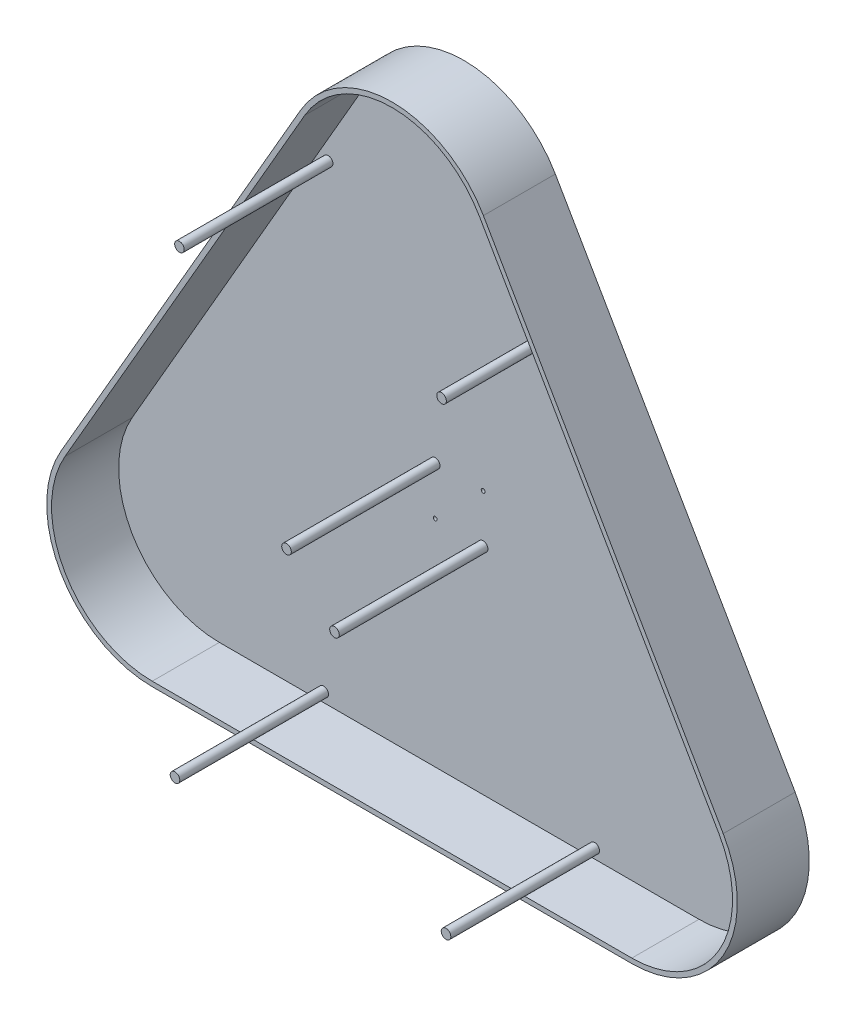
ISO-10303-21;
HEADER;
FILE_DESCRIPTION(('STEP AP214'),'2;1');
FILE_NAME('part.step','',(''),(''),'','','');
FILE_SCHEMA(('AUTOMOTIVE_DESIGN { 1 0 10303 214 1 1 1 1 }'));
ENDSEC;
DATA;
#1=APPLICATION_CONTEXT('core data for automotive mechanical design processes');
#2=APPLICATION_PROTOCOL_DEFINITION('international standard','automotive_design',2000,#1);
#3=PRODUCT_CONTEXT('',#1,'mechanical');
#4=PRODUCT('Part','Part','',(#3));
#5=PRODUCT_RELATED_PRODUCT_CATEGORY('part','',(#4));
#6=PRODUCT_DEFINITION_FORMATION('','',#4);
#7=PRODUCT_DEFINITION_CONTEXT('part definition',#1,'design');
#8=PRODUCT_DEFINITION('design','',#6,#7);
#9=PRODUCT_DEFINITION_SHAPE('','',#8);
#10=(LENGTH_UNIT() NAMED_UNIT(*) SI_UNIT(.MILLI.,.METRE.));
#11=(NAMED_UNIT(*) PLANE_ANGLE_UNIT() SI_UNIT($,.RADIAN.));
#12=(NAMED_UNIT(*) SI_UNIT($,.STERADIAN.) SOLID_ANGLE_UNIT());
#13=UNCERTAINTY_MEASURE_WITH_UNIT(LENGTH_MEASURE(1.E-05),#10,'distance_accuracy_value','');
#14=(GEOMETRIC_REPRESENTATION_CONTEXT(3) GLOBAL_UNCERTAINTY_ASSIGNED_CONTEXT((#13)) GLOBAL_UNIT_ASSIGNED_CONTEXT((#10,
#11,#12)) REPRESENTATION_CONTEXT('',''));
#15=CARTESIAN_POINT('',(0.,0.,0.));
#16=DIRECTION('',(0.,0.,1.));
#17=DIRECTION('',(1.,0.,0.));
#18=AXIS2_PLACEMENT_3D('',#15,#16,#17);
#19=CARTESIAN_POINT('',(-250.,-144.337567297407,5.));
#20=DIRECTION('',(0.,0.,1.));
#21=DIRECTION('',(1.,0.,0.));
#22=AXIS2_PLACEMENT_3D('',#19,#20,#21);
#23=PLANE('',#22);
#24=CARTESIAN_POINT('',(141.281953731993,-239.337567297406,5.));
#25=DIRECTION('',(0.,0.,1.));
#26=DIRECTION('',(1.,0.,0.));
#27=AXIS2_PLACEMENT_3D('',#24,#25,#26);
#28=CIRCLE('',#27,5.00000000000002);
#29=CARTESIAN_POINT('',(146.281953731993,-239.337567297406,5.));
#30=VERTEX_POINT('',#29);
#31=EDGE_CURVE('E15025',#30,#30,#28,.T.);
#32=ORIENTED_EDGE('',*,*,#31,.F.);
#33=EDGE_LOOP('',(#32));
#34=FACE_BOUND('',#33,.T.);
#35=CARTESIAN_POINT('',(-141.281953731986,-239.337567297406,5.));
#36=DIRECTION('',(0.,0.,1.));
#37=DIRECTION('',(1.,0.,0.));
#38=AXIS2_PLACEMENT_3D('',#35,#36,#37);
#39=CIRCLE('',#38,4.99999999999999);
#40=CARTESIAN_POINT('',(-136.281953731986,-239.337567297406,5.));
#41=VERTEX_POINT('',#40);
#42=EDGE_CURVE('E15032',#41,#41,#39,.T.);
#43=ORIENTED_EDGE('',*,*,#42,.F.);
#44=EDGE_LOOP('',(#43));
#45=FACE_BOUND('',#44,.T.);
#46=CARTESIAN_POINT('',(-136.631436493527,242.022544676904,5.));
#47=DIRECTION('',(0.,0.,1.));
#48=DIRECTION('',(1.,0.,0.));
#49=AXIS2_PLACEMENT_3D('',#46,#47,#48);
#50=CIRCLE('',#49,4.99999999999999);
#51=CARTESIAN_POINT('',(-131.631436493527,242.022544676904,5.));
#52=VERTEX_POINT('',#51);
#53=EDGE_CURVE('E15040',#52,#52,#50,.T.);
#54=ORIENTED_EDGE('',*,*,#53,.F.);
#55=EDGE_LOOP('',(#54));
#56=FACE_BOUND('',#55,.T.);
#57=CARTESIAN_POINT('',(136.631436493528,242.022544676907,5.));
#58=DIRECTION('',(0.,0.,1.));
#59=DIRECTION('',(1.,0.,0.));
#60=AXIS2_PLACEMENT_3D('',#57,#58,#59);
#61=CIRCLE('',#60,4.99999999999999);
#62=CARTESIAN_POINT('',(141.631436493528,242.022544676907,5.));
#63=VERTEX_POINT('',#62);
#64=EDGE_CURVE('E15048',#63,#63,#61,.T.);
#65=ORIENTED_EDGE('',*,*,#64,.F.);
#66=EDGE_LOOP('',(#65));
#67=FACE_BOUND('',#66,.T.);
#68=CARTESIAN_POINT('',(25.,-25.,5.));
#69=DIRECTION('',(0.,0.,1.));
#70=DIRECTION('',(1.,0.,0.));
#71=AXIS2_PLACEMENT_3D('',#68,#69,#70);
#72=CIRCLE('',#71,5.);
#73=CARTESIAN_POINT('',(30.,-25.,5.));
#74=VERTEX_POINT('',#73);
#75=EDGE_CURVE('E15056',#74,#74,#72,.T.);
#76=ORIENTED_EDGE('',*,*,#75,.F.);
#77=EDGE_LOOP('',(#76));
#78=FACE_BOUND('',#77,.T.);
#79=CARTESIAN_POINT('',(-25.,25.,5.));
#80=DIRECTION('',(0.,0.,1.));
#81=DIRECTION('',(1.,0.,0.));
#82=AXIS2_PLACEMENT_3D('',#79,#80,#81);
#83=CIRCLE('',#82,5.);
#84=CARTESIAN_POINT('',(-20.,25.,5.));
#85=VERTEX_POINT('',#84);
#86=EDGE_CURVE('E15067',#85,#85,#83,.T.);
#87=ORIENTED_EDGE('',*,*,#86,.F.);
#88=EDGE_LOOP('',(#87));
#89=FACE_BOUND('',#88,.T.);
#90=CARTESIAN_POINT('',(25.,25.,5.));
#91=DIRECTION('',(0.,0.,1.));
#92=DIRECTION('',(1.,0.,0.));
#93=AXIS2_PLACEMENT_3D('',#90,#91,#92);
#94=CIRCLE('',#93,2.);
#95=CARTESIAN_POINT('',(27.,25.,5.));
#96=VERTEX_POINT('',#95);
#97=EDGE_CURVE('E14584',#96,#96,#94,.T.);
#98=ORIENTED_EDGE('',*,*,#97,.F.);
#99=EDGE_LOOP('',(#98));
#100=FACE_BOUND('',#99,.T.);
#101=CARTESIAN_POINT('',(-25.,-25.,5.));
#102=DIRECTION('',(0.,0.,1.));
#103=DIRECTION('',(1.,0.,0.));
#104=AXIS2_PLACEMENT_3D('',#101,#102,#103);
#105=CIRCLE('',#104,2.);
#106=CARTESIAN_POINT('',(-23.,-25.,5.));
#107=VERTEX_POINT('',#106);
#108=EDGE_CURVE('E14593',#107,#107,#105,.T.);
#109=ORIENTED_EDGE('',*,*,#108,.F.);
#110=EDGE_LOOP('',(#109));
#111=FACE_BOUND('',#110,.T.);
#112=CARTESIAN_POINT('',(-250.,-144.337567297407,5.));
#113=DIRECTION('',(0.,0.,1.));
#114=DIRECTION('',(1.,0.,0.));
#115=AXIS2_PLACEMENT_3D('',#112,#113,#114);
#116=CIRCLE('',#115,105.);
#117=CARTESIAN_POINT('',(-340.932667397366,-91.837567297407,5.));
#118=VERTEX_POINT('',#117);
#119=CARTESIAN_POINT('',(-250.,-249.337567297407,5.));
#120=VERTEX_POINT('',#119);
#121=EDGE_CURVE('E14603',#118,#120,#116,.T.);
#122=ORIENTED_EDGE('',*,*,#121,.T.);
#123=DIRECTION('',(1.,0.,0.));
#124=VECTOR('',#123,1.);
#125=CARTESIAN_POINT('',(-250.,-249.337567297407,5.));
#126=LINE('',#125,#124);
#127=CARTESIAN_POINT('',(250.,-249.337567297407,5.));
#128=VERTEX_POINT('',#127);
#129=EDGE_CURVE('E14463',#120,#128,#126,.T.);
#130=ORIENTED_EDGE('',*,*,#129,.T.);
#131=CARTESIAN_POINT('',(250.,-144.337567297407,5.));
#132=DIRECTION('',(0.,0.,1.));
#133=DIRECTION('',(1.,0.,0.));
#134=AXIS2_PLACEMENT_3D('',#131,#132,#133);
#135=CIRCLE('',#134,105.);
#136=CARTESIAN_POINT('',(340.932667397366,-91.8375672974071,5.));
#137=VERTEX_POINT('',#136);
#138=EDGE_CURVE('E14608',#128,#137,#135,.T.);
#139=ORIENTED_EDGE('',*,*,#138,.T.);
#140=DIRECTION('',(-0.5,0.866025403784439,0.));
#141=VECTOR('',#140,1.);
#142=CARTESIAN_POINT('',(340.932667397366,-91.8375672974071,5.));
#143=LINE('',#142,#141);
#144=CARTESIAN_POINT('',(90.9326673973661,341.175134594813,5.));
#145=VERTEX_POINT('',#144);
#146=EDGE_CURVE('E14391',#137,#145,#143,.T.);
#147=ORIENTED_EDGE('',*,*,#146,.T.);
#148=CARTESIAN_POINT('',(0.,288.675134594813,5.));
#149=DIRECTION('',(0.,0.,1.));
#150=DIRECTION('',(-1.,0.,0.));
#151=AXIS2_PLACEMENT_3D('',#148,#149,#150);
#152=CIRCLE('',#151,105.);
#153=CARTESIAN_POINT('',(-90.9326673973661,341.175134594813,5.));
#154=VERTEX_POINT('',#153);
#155=EDGE_CURVE('E14376',#145,#154,#152,.T.);
#156=ORIENTED_EDGE('',*,*,#155,.T.);
#157=DIRECTION('',(-0.5,-0.866025403784439,0.));
#158=VECTOR('',#157,1.);
#159=CARTESIAN_POINT('',(-90.9326673973661,341.175134594813,5.));
#160=LINE('',#159,#158);
#161=EDGE_CURVE('E12',#154,#118,#160,.T.);
#162=ORIENTED_EDGE('',*,*,#161,.T.);
#163=EDGE_LOOP('',(#122,#130,#139,#147,#156,#162));
#164=FACE_BOUND('',#163,.T.);
#165=ADVANCED_FACE('F14367',(#34,#45,#56,#67,#78,#89,#100,#111,#164),#23,.T.);
#166=CARTESIAN_POINT('',(-250.,-144.337567297407,0.));
#167=DIRECTION('',(0.,0.,1.));
#168=DIRECTION('',(1.,0.,0.));
#169=AXIS2_PLACEMENT_3D('',#166,#167,#168);
#170=PLANE('',#169);
#171=CARTESIAN_POINT('',(25.,25.,0.));
#172=DIRECTION('',(0.,0.,1.));
#173=DIRECTION('',(1.,0.,0.));
#174=AXIS2_PLACEMENT_3D('',#171,#172,#173);
#175=CIRCLE('',#174,2.);
#176=CARTESIAN_POINT('',(27.,25.,0.));
#177=VERTEX_POINT('',#176);
#178=EDGE_CURVE('E14589',#177,#177,#175,.T.);
#179=ORIENTED_EDGE('',*,*,#178,.T.);
#180=EDGE_LOOP('',(#179));
#181=FACE_BOUND('',#180,.T.);
#182=CARTESIAN_POINT('',(-25.,-25.,0.));
#183=DIRECTION('',(0.,0.,1.));
#184=DIRECTION('',(1.,0.,0.));
#185=AXIS2_PLACEMENT_3D('',#182,#183,#184);
#186=CIRCLE('',#185,2.);
#187=CARTESIAN_POINT('',(-23.,-25.,0.));
#188=VERTEX_POINT('',#187);
#189=EDGE_CURVE('E14583',#188,#188,#186,.T.);
#190=ORIENTED_EDGE('',*,*,#189,.T.);
#191=EDGE_LOOP('',(#190));
#192=FACE_BOUND('',#191,.T.);
#193=CARTESIAN_POINT('',(25.,-25.,0.));
#194=DIRECTION('',(0.,0.,1.));
#195=DIRECTION('',(1.,0.,0.));
#196=AXIS2_PLACEMENT_3D('',#193,#194,#195);
#197=CIRCLE('',#196,2.);
#198=CARTESIAN_POINT('',(27.,-25.,0.));
#199=VERTEX_POINT('',#198);
#200=EDGE_CURVE('E14565',#199,#199,#197,.T.);
#201=ORIENTED_EDGE('',*,*,#200,.T.);
#202=EDGE_LOOP('',(#201));
#203=FACE_BOUND('',#202,.T.);
#204=CARTESIAN_POINT('',(-25.,25.,0.));
#205=DIRECTION('',(0.,0.,1.));
#206=DIRECTION('',(1.,0.,0.));
#207=AXIS2_PLACEMENT_3D('',#204,#205,#206);
#208=CIRCLE('',#207,2.);
#209=CARTESIAN_POINT('',(-23.,25.,0.));
#210=VERTEX_POINT('',#209);
#211=EDGE_CURVE('E14588',#210,#210,#208,.T.);
#212=ORIENTED_EDGE('',*,*,#211,.T.);
#213=EDGE_LOOP('',(#212));
#214=FACE_BOUND('',#213,.T.);
#215=CARTESIAN_POINT('',(-250.,-144.337567297407,0.));
#216=DIRECTION('',(0.,0.,1.));
#217=DIRECTION('',(1.,0.,0.));
#218=AXIS2_PLACEMENT_3D('',#215,#216,#217);
#219=CIRCLE('',#218,110.);
#220=CARTESIAN_POINT('',(-345.262794416288,-89.337567297407,0.));
#221=VERTEX_POINT('',#220);
#222=CARTESIAN_POINT('',(-250.,-254.337567297407,0.));
#223=VERTEX_POINT('',#222);
#224=EDGE_CURVE('E14526',#221,#223,#219,.T.);
#225=ORIENTED_EDGE('',*,*,#224,.F.);
#226=DIRECTION('',(-0.5,-0.866025403784439,0.));
#227=VECTOR('',#226,1.);
#228=CARTESIAN_POINT('',(-95.2627944162883,343.675134594813,0.));
#229=LINE('',#228,#227);
#230=CARTESIAN_POINT('',(-95.2627944162883,343.675134594813,0.));
#231=VERTEX_POINT('',#230);
#232=EDGE_CURVE('E14557',#231,#221,#229,.T.);
#233=ORIENTED_EDGE('',*,*,#232,.F.);
#234=CARTESIAN_POINT('',(0.,288.675134594813,0.));
#235=DIRECTION('',(0.,0.,1.));
#236=DIRECTION('',(1.,0.,0.));
#237=AXIS2_PLACEMENT_3D('',#234,#235,#236);
#238=CIRCLE('',#237,110.);
#239=CARTESIAN_POINT('',(95.2627944162883,343.675134594813,0.));
#240=VERTEX_POINT('',#239);
#241=EDGE_CURVE('E14553',#240,#231,#238,.T.);
#242=ORIENTED_EDGE('',*,*,#241,.F.);
#243=DIRECTION('',(-0.5,0.866025403784439,0.));
#244=VECTOR('',#243,1.);
#245=CARTESIAN_POINT('',(345.262794416288,-89.3375672974071,0.));
#246=LINE('',#245,#244);
#247=CARTESIAN_POINT('',(345.262794416288,-89.3375672974071,0.));
#248=VERTEX_POINT('',#247);
#249=EDGE_CURVE('E14549',#248,#240,#246,.T.);
#250=ORIENTED_EDGE('',*,*,#249,.F.);
#251=CARTESIAN_POINT('',(250.,-144.337567297407,0.));
#252=DIRECTION('',(0.,0.,1.));
#253=DIRECTION('',(1.,0.,0.));
#254=AXIS2_PLACEMENT_3D('',#251,#252,#253);
#255=CIRCLE('',#254,110.);
#256=CARTESIAN_POINT('',(250.,-254.337567297407,0.));
#257=VERTEX_POINT('',#256);
#258=EDGE_CURVE('E14545',#257,#248,#255,.T.);
#259=ORIENTED_EDGE('',*,*,#258,.F.);
#260=DIRECTION('',(1.,0.,0.));
#261=VECTOR('',#260,1.);
#262=CARTESIAN_POINT('',(-250.,-254.337567297407,0.));
#263=LINE('',#262,#261);
#264=EDGE_CURVE('E14541',#223,#257,#263,.T.);
#265=ORIENTED_EDGE('',*,*,#264,.F.);
#266=EDGE_LOOP('',(#225,#233,#242,#250,#259,#265));
#267=FACE_BOUND('',#266,.T.);
#268=ADVANCED_FACE('F14369',(#181,#192,#203,#214,#267),#170,.F.);
#269=CARTESIAN_POINT('',(-25.,25.,0.));
#270=DIRECTION('',(0.,0.,1.));
#271=DIRECTION('',(1.,0.,0.));
#272=AXIS2_PLACEMENT_3D('',#269,#270,#271);
#273=CYLINDRICAL_SURFACE('',#272,2.);
#274=ORIENTED_EDGE('',*,*,#211,.F.);
#275=EDGE_LOOP('',(#274));
#276=FACE_BOUND('',#275,.T.);
#277=CARTESIAN_POINT('',(-25.,25.,5.));
#278=DIRECTION('',(0.,0.,1.));
#279=DIRECTION('',(1.,0.,0.));
#280=AXIS2_PLACEMENT_3D('',#277,#278,#279);
#281=CIRCLE('',#280,2.);
#282=CARTESIAN_POINT('',(-23.,25.,5.));
#283=VERTEX_POINT('',#282);
#284=EDGE_CURVE('E14478',#283,#283,#281,.F.);
#285=ORIENTED_EDGE('',*,*,#284,.F.);
#286=EDGE_LOOP('',(#285));
#287=FACE_BOUND('',#286,.T.);
#288=ADVANCED_FACE('F14640',(#276,#287),#273,.F.);
#289=CARTESIAN_POINT('',(25.,-25.,0.));
#290=DIRECTION('',(0.,0.,1.));
#291=DIRECTION('',(1.,0.,0.));
#292=AXIS2_PLACEMENT_3D('',#289,#290,#291);
#293=CYLINDRICAL_SURFACE('',#292,2.);
#294=ORIENTED_EDGE('',*,*,#200,.F.);
#295=EDGE_LOOP('',(#294));
#296=FACE_BOUND('',#295,.T.);
#297=CARTESIAN_POINT('',(25.,-25.,5.));
#298=DIRECTION('',(0.,0.,1.));
#299=DIRECTION('',(1.,0.,0.));
#300=AXIS2_PLACEMENT_3D('',#297,#298,#299);
#301=CIRCLE('',#300,2.);
#302=CARTESIAN_POINT('',(27.,-25.,5.));
#303=VERTEX_POINT('',#302);
#304=EDGE_CURVE('E15060',#303,#303,#301,.F.);
#305=ORIENTED_EDGE('',*,*,#304,.F.);
#306=EDGE_LOOP('',(#305));
#307=FACE_BOUND('',#306,.T.);
#308=ADVANCED_FACE('F14647',(#296,#307),#293,.F.);
#309=CARTESIAN_POINT('',(-25.,-25.,0.));
#310=DIRECTION('',(0.,0.,1.));
#311=DIRECTION('',(1.,0.,0.));
#312=AXIS2_PLACEMENT_3D('',#309,#310,#311);
#313=CYLINDRICAL_SURFACE('',#312,2.);
#314=ORIENTED_EDGE('',*,*,#189,.F.);
#315=EDGE_LOOP('',(#314));
#316=FACE_BOUND('',#315,.T.);
#317=ORIENTED_EDGE('',*,*,#108,.T.);
#318=EDGE_LOOP('',(#317));
#319=FACE_BOUND('',#318,.T.);
#320=ADVANCED_FACE('F14649',(#316,#319),#313,.F.);
#321=CARTESIAN_POINT('',(25.,25.,0.));
#322=DIRECTION('',(0.,0.,1.));
#323=DIRECTION('',(1.,0.,0.));
#324=AXIS2_PLACEMENT_3D('',#321,#322,#323);
#325=CYLINDRICAL_SURFACE('',#324,2.);
#326=ORIENTED_EDGE('',*,*,#178,.F.);
#327=EDGE_LOOP('',(#326));
#328=FACE_BOUND('',#327,.T.);
#329=ORIENTED_EDGE('',*,*,#97,.T.);
#330=EDGE_LOOP('',(#329));
#331=FACE_BOUND('',#330,.T.);
#332=ADVANCED_FACE('F14652',(#328,#331),#325,.F.);
#333=CARTESIAN_POINT('',(-250.,-144.337567297407,0.));
#334=DIRECTION('',(0.,0.,1.));
#335=DIRECTION('',(1.,0.,0.));
#336=AXIS2_PLACEMENT_3D('',#333,#334,#335);
#337=CYLINDRICAL_SURFACE('',#336,110.);
#338=DIRECTION('',(0.,0.,1.));
#339=VECTOR('',#338,1.);
#340=CARTESIAN_POINT('',(-250.,-254.337567297407,0.));
#341=LINE('',#340,#339);
#342=CARTESIAN_POINT('',(-250.,-254.337567297407,75.));
#343=VERTEX_POINT('',#342);
#344=EDGE_CURVE('E14561',#223,#343,#341,.T.);
#345=ORIENTED_EDGE('',*,*,#344,.T.);
#346=CARTESIAN_POINT('',(-250.,-144.337567297407,75.));
#347=DIRECTION('',(0.,0.,1.));
#348=DIRECTION('',(1.,0.,0.));
#349=AXIS2_PLACEMENT_3D('',#346,#347,#348);
#350=CIRCLE('',#349,110.);
#351=CARTESIAN_POINT('',(-345.262794416288,-89.337567297407,75.));
#352=VERTEX_POINT('',#351);
#353=EDGE_CURVE('E14501',#352,#343,#350,.T.);
#354=ORIENTED_EDGE('',*,*,#353,.F.);
#355=DIRECTION('',(0.,0.,1.));
#356=VECTOR('',#355,1.);
#357=CARTESIAN_POINT('',(-345.262794416288,-89.337567297407,0.));
#358=LINE('',#357,#356);
#359=EDGE_CURVE('E14562',#221,#352,#358,.T.);
#360=ORIENTED_EDGE('',*,*,#359,.F.);
#361=ORIENTED_EDGE('',*,*,#224,.T.);
#362=EDGE_LOOP('',(#345,#354,#360,#361));
#363=FACE_BOUND('',#362,.T.);
#364=ADVANCED_FACE('F14656',(#363),#337,.T.);
#365=CARTESIAN_POINT('',(-95.2627944162883,343.675134594813,0.));
#366=DIRECTION('',(-0.866025403784439,0.5,0.));
#367=DIRECTION('',(-0.5,-0.866025403784439,0.));
#368=AXIS2_PLACEMENT_3D('',#365,#366,#367);
#369=PLANE('',#368);
#370=ORIENTED_EDGE('',*,*,#359,.T.);
#371=DIRECTION('',(-0.5,-0.866025403784439,0.));
#372=VECTOR('',#371,1.);
#373=CARTESIAN_POINT('',(-95.2627944162883,343.675134594813,75.));
#374=LINE('',#373,#372);
#375=CARTESIAN_POINT('',(-95.2627944162883,343.675134594813,75.));
#376=VERTEX_POINT('',#375);
#377=EDGE_CURVE('E14467',#376,#352,#374,.T.);
#378=ORIENTED_EDGE('',*,*,#377,.F.);
#379=DIRECTION('',(0.,0.,1.));
#380=VECTOR('',#379,1.);
#381=CARTESIAN_POINT('',(-95.2627944162883,343.675134594813,0.));
#382=LINE('',#381,#380);
#383=EDGE_CURVE('E14566',#231,#376,#382,.T.);
#384=ORIENTED_EDGE('',*,*,#383,.F.);
#385=ORIENTED_EDGE('',*,*,#232,.T.);
#386=EDGE_LOOP('',(#370,#378,#384,#385));
#387=FACE_BOUND('',#386,.T.);
#388=ADVANCED_FACE('F14663',(#387),#369,.T.);
#389=CARTESIAN_POINT('',(0.,288.675134594813,0.));
#390=DIRECTION('',(0.,0.,1.));
#391=DIRECTION('',(1.,0.,0.));
#392=AXIS2_PLACEMENT_3D('',#389,#390,#391);
#393=CYLINDRICAL_SURFACE('',#392,110.);
#394=ORIENTED_EDGE('',*,*,#383,.T.);
#395=CARTESIAN_POINT('',(0.,288.675134594813,75.));
#396=DIRECTION('',(0.,0.,1.));
#397=DIRECTION('',(1.,0.,0.));
#398=AXIS2_PLACEMENT_3D('',#395,#396,#397);
#399=CIRCLE('',#398,110.);
#400=CARTESIAN_POINT('',(95.2627944162883,343.675134594813,75.));
#401=VERTEX_POINT('',#400);
#402=EDGE_CURVE('E14517',#401,#376,#399,.T.);
#403=ORIENTED_EDGE('',*,*,#402,.F.);
#404=DIRECTION('',(0.,0.,1.));
#405=VECTOR('',#404,1.);
#406=CARTESIAN_POINT('',(95.2627944162883,343.675134594813,0.));
#407=LINE('',#406,#405);
#408=EDGE_CURVE('E14569',#240,#401,#407,.T.);
#409=ORIENTED_EDGE('',*,*,#408,.F.);
#410=ORIENTED_EDGE('',*,*,#241,.T.);
#411=EDGE_LOOP('',(#394,#403,#409,#410));
#412=FACE_BOUND('',#411,.T.);
#413=ADVANCED_FACE('F14675',(#412),#393,.T.);
#414=CARTESIAN_POINT('',(345.262794416288,-89.3375672974071,0.));
#415=DIRECTION('',(0.866025403784439,0.5,0.));
#416=DIRECTION('',(-0.5,0.866025403784439,0.));
#417=AXIS2_PLACEMENT_3D('',#414,#415,#416);
#418=PLANE('',#417);
#419=ORIENTED_EDGE('',*,*,#408,.T.);
#420=DIRECTION('',(-0.5,0.866025403784439,0.));
#421=VECTOR('',#420,1.);
#422=CARTESIAN_POINT('',(345.262794416288,-89.3375672974071,75.));
#423=LINE('',#422,#421);
#424=CARTESIAN_POINT('',(345.262794416288,-89.3375672974071,75.));
#425=VERTEX_POINT('',#424);
#426=EDGE_CURVE('E14513',#425,#401,#423,.T.);
#427=ORIENTED_EDGE('',*,*,#426,.F.);
#428=DIRECTION('',(0.,0.,1.));
#429=VECTOR('',#428,1.);
#430=CARTESIAN_POINT('',(345.262794416288,-89.3375672974071,0.));
#431=LINE('',#430,#429);
#432=EDGE_CURVE('E14572',#248,#425,#431,.T.);
#433=ORIENTED_EDGE('',*,*,#432,.F.);
#434=ORIENTED_EDGE('',*,*,#249,.T.);
#435=EDGE_LOOP('',(#419,#427,#433,#434));
#436=FACE_BOUND('',#435,.T.);
#437=ADVANCED_FACE('F14671',(#436),#418,.T.);
#438=CARTESIAN_POINT('',(250.,-144.337567297407,0.));
#439=DIRECTION('',(0.,0.,1.));
#440=DIRECTION('',(1.,0.,0.));
#441=AXIS2_PLACEMENT_3D('',#438,#439,#440);
#442=CYLINDRICAL_SURFACE('',#441,110.);
#443=ORIENTED_EDGE('',*,*,#432,.T.);
#444=CARTESIAN_POINT('',(250.,-144.337567297407,75.));
#445=DIRECTION('',(0.,0.,1.));
#446=DIRECTION('',(1.,0.,0.));
#447=AXIS2_PLACEMENT_3D('',#444,#445,#446);
#448=CIRCLE('',#447,110.);
#449=CARTESIAN_POINT('',(250.,-254.337567297407,75.));
#450=VERTEX_POINT('',#449);
#451=EDGE_CURVE('E14509',#450,#425,#448,.T.);
#452=ORIENTED_EDGE('',*,*,#451,.F.);
#453=DIRECTION('',(0.,0.,1.));
#454=VECTOR('',#453,1.);
#455=CARTESIAN_POINT('',(250.,-254.337567297407,0.));
#456=LINE('',#455,#454);
#457=EDGE_CURVE('E14575',#257,#450,#456,.T.);
#458=ORIENTED_EDGE('',*,*,#457,.F.);
#459=ORIENTED_EDGE('',*,*,#258,.T.);
#460=EDGE_LOOP('',(#443,#452,#458,#459));
#461=FACE_BOUND('',#460,.T.);
#462=ADVANCED_FACE('F14667',(#461),#442,.T.);
#463=CARTESIAN_POINT('',(-250.,-254.337567297407,0.));
#464=DIRECTION('',(0.,-1.,0.));
#465=DIRECTION('',(0.,0.,-1.));
#466=AXIS2_PLACEMENT_3D('',#463,#464,#465);
#467=PLANE('',#466);
#468=ORIENTED_EDGE('',*,*,#457,.T.);
#469=DIRECTION('',(1.,0.,0.));
#470=VECTOR('',#469,1.);
#471=CARTESIAN_POINT('',(-250.,-254.337567297407,75.));
#472=LINE('',#471,#470);
#473=EDGE_CURVE('E14505',#343,#450,#472,.T.);
#474=ORIENTED_EDGE('',*,*,#473,.F.);
#475=ORIENTED_EDGE('',*,*,#344,.F.);
#476=ORIENTED_EDGE('',*,*,#264,.T.);
#477=EDGE_LOOP('',(#468,#474,#475,#476));
#478=FACE_BOUND('',#477,.T.);
#479=ADVANCED_FACE('F14630',(#478),#467,.T.);
#480=CARTESIAN_POINT('',(-250.,-144.337567297407,0.));
#481=DIRECTION('',(0.,0.,1.));
#482=DIRECTION('',(1.,0.,0.));
#483=AXIS2_PLACEMENT_3D('',#480,#481,#482);
#484=CYLINDRICAL_SURFACE('',#483,105.);
#485=ORIENTED_EDGE('',*,*,#121,.F.);
#486=DIRECTION('',(0.,0.,1.));
#487=VECTOR('',#486,1.);
#488=CARTESIAN_POINT('',(-340.932667397366,-91.837567297407,0.));
#489=LINE('',#488,#487);
#490=CARTESIAN_POINT('',(-340.932667397366,-91.837567297407,75.));
#491=VERTEX_POINT('',#490);
#492=EDGE_CURVE('E14473',#118,#491,#489,.T.);
#493=ORIENTED_EDGE('',*,*,#492,.T.);
#494=CARTESIAN_POINT('',(-250.,-144.337567297407,75.));
#495=DIRECTION('',(0.,0.,1.));
#496=DIRECTION('',(1.,0.,0.));
#497=AXIS2_PLACEMENT_3D('',#494,#495,#496);
#498=CIRCLE('',#497,105.);
#499=CARTESIAN_POINT('',(-250.,-249.337567297407,75.));
#500=VERTEX_POINT('',#499);
#501=EDGE_CURVE('E14470',#491,#500,#498,.T.);
#502=ORIENTED_EDGE('',*,*,#501,.T.);
#503=DIRECTION('',(0.,0.,1.));
#504=VECTOR('',#503,1.);
#505=CARTESIAN_POINT('',(-250.,-249.337567297407,0.));
#506=LINE('',#505,#504);
#507=EDGE_CURVE('E14456',#120,#500,#506,.T.);
#508=ORIENTED_EDGE('',*,*,#507,.F.);
#509=EDGE_LOOP('',(#485,#493,#502,#508));
#510=FACE_BOUND('',#509,.T.);
#511=ADVANCED_FACE('F14471',(#510),#484,.F.);
#512=CARTESIAN_POINT('',(-90.9326673973661,341.175134594813,0.));
#513=DIRECTION('',(-0.866025403784439,0.5,0.));
#514=DIRECTION('',(-0.5,-0.866025403784439,0.));
#515=AXIS2_PLACEMENT_3D('',#512,#513,#514);
#516=PLANE('',#515);
#517=ORIENTED_EDGE('',*,*,#161,.F.);
#518=DIRECTION('',(0.,0.,1.));
#519=VECTOR('',#518,1.);
#520=CARTESIAN_POINT('',(-90.9326673973661,341.175134594813,0.));
#521=LINE('',#520,#519);
#522=CARTESIAN_POINT('',(-90.9326673973661,341.175134594813,75.));
#523=VERTEX_POINT('',#522);
#524=EDGE_CURVE('E14527',#154,#523,#521,.T.);
#525=ORIENTED_EDGE('',*,*,#524,.T.);
#526=DIRECTION('',(-0.5,-0.866025403784439,0.));
#527=VECTOR('',#526,1.);
#528=CARTESIAN_POINT('',(-90.9326673973661,341.175134594813,75.));
#529=LINE('',#528,#527);
#530=EDGE_CURVE('E14498',#523,#491,#529,.T.);
#531=ORIENTED_EDGE('',*,*,#530,.T.);
#532=ORIENTED_EDGE('',*,*,#492,.F.);
#533=EDGE_LOOP('',(#517,#525,#531,#532));
#534=FACE_BOUND('',#533,.T.);
#535=ADVANCED_FACE('F14622',(#534),#516,.F.);
#536=CARTESIAN_POINT('',(0.,288.675134594813,0.));
#537=DIRECTION('',(0.,0.,1.));
#538=DIRECTION('',(1.,0.,0.));
#539=AXIS2_PLACEMENT_3D('',#536,#537,#538);
#540=CYLINDRICAL_SURFACE('',#539,105.);
#541=ORIENTED_EDGE('',*,*,#155,.F.);
#542=DIRECTION('',(0.,0.,1.));
#543=VECTOR('',#542,1.);
#544=CARTESIAN_POINT('',(90.9326673973661,341.175134594813,0.));
#545=LINE('',#544,#543);
#546=CARTESIAN_POINT('',(90.9326673973661,341.175134594813,75.));
#547=VERTEX_POINT('',#546);
#548=EDGE_CURVE('E14530',#145,#547,#545,.T.);
#549=ORIENTED_EDGE('',*,*,#548,.T.);
#550=CARTESIAN_POINT('',(0.,288.675134594813,75.));
#551=DIRECTION('',(0.,0.,1.));
#552=DIRECTION('',(1.,0.,0.));
#553=AXIS2_PLACEMENT_3D('',#550,#551,#552);
#554=CIRCLE('',#553,105.);
#555=EDGE_CURVE('E14494',#547,#523,#554,.T.);
#556=ORIENTED_EDGE('',*,*,#555,.T.);
#557=ORIENTED_EDGE('',*,*,#524,.F.);
#558=EDGE_LOOP('',(#541,#549,#556,#557));
#559=FACE_BOUND('',#558,.T.);
#560=ADVANCED_FACE('F14618',(#559),#540,.F.);
#561=CARTESIAN_POINT('',(340.932667397366,-91.8375672974071,0.));
#562=DIRECTION('',(0.866025403784439,0.5,0.));
#563=DIRECTION('',(-0.5,0.866025403784439,0.));
#564=AXIS2_PLACEMENT_3D('',#561,#562,#563);
#565=PLANE('',#564);
#566=ORIENTED_EDGE('',*,*,#146,.F.);
#567=DIRECTION('',(0.,0.,1.));
#568=VECTOR('',#567,1.);
#569=CARTESIAN_POINT('',(340.932667397366,-91.8375672974071,0.));
#570=LINE('',#569,#568);
#571=CARTESIAN_POINT('',(340.932667397366,-91.8375672974071,75.));
#572=VERTEX_POINT('',#571);
#573=EDGE_CURVE('E14533',#137,#572,#570,.T.);
#574=ORIENTED_EDGE('',*,*,#573,.T.);
#575=DIRECTION('',(-0.5,0.866025403784439,0.));
#576=VECTOR('',#575,1.);
#577=CARTESIAN_POINT('',(340.932667397366,-91.8375672974071,75.));
#578=LINE('',#577,#576);
#579=EDGE_CURVE('E14487',#572,#547,#578,.T.);
#580=ORIENTED_EDGE('',*,*,#579,.T.);
#581=ORIENTED_EDGE('',*,*,#548,.F.);
#582=EDGE_LOOP('',(#566,#574,#580,#581));
#583=FACE_BOUND('',#582,.T.);
#584=ADVANCED_FACE('F14619',(#583),#565,.F.);
#585=CARTESIAN_POINT('',(250.,-144.337567297407,0.));
#586=DIRECTION('',(0.,0.,1.));
#587=DIRECTION('',(1.,0.,0.));
#588=AXIS2_PLACEMENT_3D('',#585,#586,#587);
#589=CYLINDRICAL_SURFACE('',#588,105.);
#590=ORIENTED_EDGE('',*,*,#138,.F.);
#591=DIRECTION('',(0.,0.,1.));
#592=VECTOR('',#591,1.);
#593=CARTESIAN_POINT('',(250.,-249.337567297407,0.));
#594=LINE('',#593,#592);
#595=CARTESIAN_POINT('',(250.,-249.337567297407,75.));
#596=VERTEX_POINT('',#595);
#597=EDGE_CURVE('E14383',#128,#596,#594,.T.);
#598=ORIENTED_EDGE('',*,*,#597,.T.);
#599=CARTESIAN_POINT('',(250.,-144.337567297407,75.));
#600=DIRECTION('',(0.,0.,1.));
#601=DIRECTION('',(1.,0.,0.));
#602=AXIS2_PLACEMENT_3D('',#599,#600,#601);
#603=CIRCLE('',#602,105.);
#604=EDGE_CURVE('E14483',#596,#572,#603,.T.);
#605=ORIENTED_EDGE('',*,*,#604,.T.);
#606=ORIENTED_EDGE('',*,*,#573,.F.);
#607=EDGE_LOOP('',(#590,#598,#605,#606));
#608=FACE_BOUND('',#607,.T.);
#609=ADVANCED_FACE('F14685',(#608),#589,.F.);
#610=CARTESIAN_POINT('',(-250.,-249.337567297407,0.));
#611=DIRECTION('',(0.,-1.,0.));
#612=DIRECTION('',(0.,0.,-1.));
#613=AXIS2_PLACEMENT_3D('',#610,#611,#612);
#614=PLANE('',#613);
#615=ORIENTED_EDGE('',*,*,#129,.F.);
#616=ORIENTED_EDGE('',*,*,#507,.T.);
#617=DIRECTION('',(1.,0.,0.));
#618=VECTOR('',#617,1.);
#619=CARTESIAN_POINT('',(-250.,-249.337567297407,75.));
#620=LINE('',#619,#618);
#621=EDGE_CURVE('E14460',#500,#596,#620,.T.);
#622=ORIENTED_EDGE('',*,*,#621,.T.);
#623=ORIENTED_EDGE('',*,*,#597,.F.);
#624=EDGE_LOOP('',(#615,#616,#622,#623));
#625=FACE_BOUND('',#624,.T.);
#626=ADVANCED_FACE('F14458',(#625),#614,.F.);
#627=CARTESIAN_POINT('',(-250.,-144.337567297407,75.));
#628=DIRECTION('',(0.,0.,1.));
#629=DIRECTION('',(1.,0.,0.));
#630=AXIS2_PLACEMENT_3D('',#627,#628,#629);
#631=PLANE('',#630);
#632=ORIENTED_EDGE('',*,*,#353,.T.);
#633=ORIENTED_EDGE('',*,*,#473,.T.);
#634=ORIENTED_EDGE('',*,*,#451,.T.);
#635=ORIENTED_EDGE('',*,*,#426,.T.);
#636=ORIENTED_EDGE('',*,*,#402,.T.);
#637=ORIENTED_EDGE('',*,*,#377,.T.);
#638=EDGE_LOOP('',(#632,#633,#634,#635,#636,#637));
#639=FACE_BOUND('',#638,.T.);
#640=ORIENTED_EDGE('',*,*,#621,.F.);
#641=ORIENTED_EDGE('',*,*,#501,.F.);
#642=ORIENTED_EDGE('',*,*,#530,.F.);
#643=ORIENTED_EDGE('',*,*,#555,.F.);
#644=ORIENTED_EDGE('',*,*,#579,.F.);
#645=ORIENTED_EDGE('',*,*,#604,.F.);
#646=EDGE_LOOP('',(#640,#641,#642,#643,#644,#645));
#647=FACE_BOUND('',#646,.T.);
#648=ADVANCED_FACE('F14480',(#639,#647),#631,.T.);
#649=CARTESIAN_POINT('',(-25.,25.,5.));
#650=DIRECTION('',(0.,0.,1.));
#651=DIRECTION('',(1.,0.,0.));
#652=AXIS2_PLACEMENT_3D('',#649,#650,#651);
#653=PLANE('',#652);
#654=ORIENTED_EDGE('',*,*,#284,.T.);
#655=EDGE_LOOP('',(#654));
#656=FACE_BOUND('',#655,.T.);
#657=ADVANCED_FACE('F14707',(#656),#653,.F.);
#658=CARTESIAN_POINT('',(-25.,25.,160.));
#659=DIRECTION('',(0.,0.,-1.));
#660=DIRECTION('',(-1.,0.,0.));
#661=AXIS2_PLACEMENT_3D('',#658,#659,#660);
#662=CYLINDRICAL_SURFACE('',#661,5.);
#663=CARTESIAN_POINT('',(-25.,25.,160.));
#664=DIRECTION('',(0.,0.,1.));
#665=DIRECTION('',(1.,0.,0.));
#666=AXIS2_PLACEMENT_3D('',#663,#664,#665);
#667=CIRCLE('',#666,5.);
#668=CARTESIAN_POINT('',(-20.,25.,160.));
#669=VERTEX_POINT('',#668);
#670=EDGE_CURVE('E15068',#669,#669,#667,.T.);
#671=ORIENTED_EDGE('',*,*,#670,.F.);
#672=EDGE_LOOP('',(#671));
#673=FACE_BOUND('',#672,.T.);
#674=ORIENTED_EDGE('',*,*,#86,.T.);
#675=EDGE_LOOP('',(#674));
#676=FACE_BOUND('',#675,.T.);
#677=ADVANCED_FACE('F14713',(#673,#676),#662,.T.);
#678=CARTESIAN_POINT('',(-25.,25.,160.));
#679=DIRECTION('',(0.,0.,1.));
#680=DIRECTION('',(1.,0.,0.));
#681=AXIS2_PLACEMENT_3D('',#678,#679,#680);
#682=PLANE('',#681);
#683=ORIENTED_EDGE('',*,*,#670,.T.);
#684=EDGE_LOOP('',(#683));
#685=FACE_BOUND('',#684,.T.);
#686=ADVANCED_FACE('F14721',(#685),#682,.T.);
#687=CARTESIAN_POINT('',(25.,-25.,5.));
#688=DIRECTION('',(0.,0.,1.));
#689=DIRECTION('',(1.,0.,0.));
#690=AXIS2_PLACEMENT_3D('',#687,#688,#689);
#691=PLANE('',#690);
#692=ORIENTED_EDGE('',*,*,#304,.T.);
#693=EDGE_LOOP('',(#692));
#694=FACE_BOUND('',#693,.T.);
#695=ADVANCED_FACE('F14729',(#694),#691,.F.);
#696=CARTESIAN_POINT('',(25.,-25.,160.));
#697=DIRECTION('',(0.,0.,-1.));
#698=DIRECTION('',(-1.,0.,0.));
#699=AXIS2_PLACEMENT_3D('',#696,#697,#698);
#700=CYLINDRICAL_SURFACE('',#699,5.);
#701=CARTESIAN_POINT('',(25.,-25.,160.));
#702=DIRECTION('',(0.,0.,1.));
#703=DIRECTION('',(1.,0.,0.));
#704=AXIS2_PLACEMENT_3D('',#701,#702,#703);
#705=CIRCLE('',#704,5.);
#706=CARTESIAN_POINT('',(30.,-25.,160.));
#707=VERTEX_POINT('',#706);
#708=EDGE_CURVE('E15052',#707,#707,#705,.T.);
#709=ORIENTED_EDGE('',*,*,#708,.F.);
#710=EDGE_LOOP('',(#709));
#711=FACE_BOUND('',#710,.T.);
#712=ORIENTED_EDGE('',*,*,#75,.T.);
#713=EDGE_LOOP('',(#712));
#714=FACE_BOUND('',#713,.T.);
#715=ADVANCED_FACE('F14737',(#711,#714),#700,.T.);
#716=CARTESIAN_POINT('',(25.,-25.,160.));
#717=DIRECTION('',(0.,0.,1.));
#718=DIRECTION('',(1.,0.,0.));
#719=AXIS2_PLACEMENT_3D('',#716,#717,#718);
#720=PLANE('',#719);
#721=ORIENTED_EDGE('',*,*,#708,.T.);
#722=EDGE_LOOP('',(#721));
#723=FACE_BOUND('',#722,.T.);
#724=ADVANCED_FACE('F14745',(#723),#720,.T.);
#725=CARTESIAN_POINT('',(136.631436493528,242.022544676907,160.));
#726=DIRECTION('',(0.,0.,-1.));
#727=DIRECTION('',(-1.,0.,0.));
#728=AXIS2_PLACEMENT_3D('',#725,#726,#727);
#729=CYLINDRICAL_SURFACE('',#728,4.99999999999999);
#730=CARTESIAN_POINT('',(136.631436493528,242.022544676907,160.));
#731=DIRECTION('',(0.,0.,1.));
#732=DIRECTION('',(1.,0.,0.));
#733=AXIS2_PLACEMENT_3D('',#730,#731,#732);
#734=CIRCLE('',#733,4.99999999999999);
#735=CARTESIAN_POINT('',(141.631436493528,242.022544676907,160.));
#736=VERTEX_POINT('',#735);
#737=EDGE_CURVE('E15044',#736,#736,#734,.T.);
#738=ORIENTED_EDGE('',*,*,#737,.F.);
#739=EDGE_LOOP('',(#738));
#740=FACE_BOUND('',#739,.T.);
#741=ORIENTED_EDGE('',*,*,#64,.T.);
#742=EDGE_LOOP('',(#741));
#743=FACE_BOUND('',#742,.T.);
#744=ADVANCED_FACE('F14753',(#740,#743),#729,.T.);
#745=CARTESIAN_POINT('',(136.631436493528,242.022544676907,160.));
#746=DIRECTION('',(0.,0.,1.));
#747=DIRECTION('',(1.,0.,0.));
#748=AXIS2_PLACEMENT_3D('',#745,#746,#747);
#749=PLANE('',#748);
#750=ORIENTED_EDGE('',*,*,#737,.T.);
#751=EDGE_LOOP('',(#750));
#752=FACE_BOUND('',#751,.T.);
#753=ADVANCED_FACE('F14761',(#752),#749,.T.);
#754=CARTESIAN_POINT('',(-136.631436493527,242.022544676904,160.));
#755=DIRECTION('',(0.,0.,-1.));
#756=DIRECTION('',(-1.,0.,0.));
#757=AXIS2_PLACEMENT_3D('',#754,#755,#756);
#758=CYLINDRICAL_SURFACE('',#757,4.99999999999999);
#759=CARTESIAN_POINT('',(-136.631436493527,242.022544676904,160.));
#760=DIRECTION('',(0.,0.,1.));
#761=DIRECTION('',(1.,0.,0.));
#762=AXIS2_PLACEMENT_3D('',#759,#760,#761);
#763=CIRCLE('',#762,4.99999999999999);
#764=CARTESIAN_POINT('',(-131.631436493527,242.022544676904,160.));
#765=VERTEX_POINT('',#764);
#766=EDGE_CURVE('E15036',#765,#765,#763,.T.);
#767=ORIENTED_EDGE('',*,*,#766,.F.);
#768=EDGE_LOOP('',(#767));
#769=FACE_BOUND('',#768,.T.);
#770=ORIENTED_EDGE('',*,*,#53,.T.);
#771=EDGE_LOOP('',(#770));
#772=FACE_BOUND('',#771,.T.);
#773=ADVANCED_FACE('F14769',(#769,#772),#758,.T.);
#774=CARTESIAN_POINT('',(-136.631436493527,242.022544676904,160.));
#775=DIRECTION('',(0.,0.,1.));
#776=DIRECTION('',(1.,0.,0.));
#777=AXIS2_PLACEMENT_3D('',#774,#775,#776);
#778=PLANE('',#777);
#779=ORIENTED_EDGE('',*,*,#766,.T.);
#780=EDGE_LOOP('',(#779));
#781=FACE_BOUND('',#780,.T.);
#782=ADVANCED_FACE('F14777',(#781),#778,.T.);
#783=CARTESIAN_POINT('',(-141.281953731986,-239.337567297406,160.));
#784=DIRECTION('',(0.,0.,-1.));
#785=DIRECTION('',(-1.,0.,0.));
#786=AXIS2_PLACEMENT_3D('',#783,#784,#785);
#787=CYLINDRICAL_SURFACE('',#786,4.99999999999999);
#788=CARTESIAN_POINT('',(-141.281953731986,-239.337567297406,160.));
#789=DIRECTION('',(0.,0.,1.));
#790=DIRECTION('',(1.,0.,0.));
#791=AXIS2_PLACEMENT_3D('',#788,#789,#790);
#792=CIRCLE('',#791,4.99999999999999);
#793=CARTESIAN_POINT('',(-136.281953731986,-239.337567297406,160.));
#794=VERTEX_POINT('',#793);
#795=EDGE_CURVE('E15029',#794,#794,#792,.T.);
#796=ORIENTED_EDGE('',*,*,#795,.F.);
#797=EDGE_LOOP('',(#796));
#798=FACE_BOUND('',#797,.T.);
#799=ORIENTED_EDGE('',*,*,#42,.T.);
#800=EDGE_LOOP('',(#799));
#801=FACE_BOUND('',#800,.T.);
#802=ADVANCED_FACE('F14785',(#798,#801),#787,.T.);
#803=CARTESIAN_POINT('',(-141.281953731986,-239.337567297406,160.));
#804=DIRECTION('',(0.,0.,1.));
#805=DIRECTION('',(1.,0.,0.));
#806=AXIS2_PLACEMENT_3D('',#803,#804,#805);
#807=PLANE('',#806);
#808=ORIENTED_EDGE('',*,*,#795,.T.);
#809=EDGE_LOOP('',(#808));
#810=FACE_BOUND('',#809,.T.);
#811=ADVANCED_FACE('F14793',(#810),#807,.T.);
#812=CARTESIAN_POINT('',(141.281953731993,-239.337567297406,160.));
#813=DIRECTION('',(0.,0.,-1.));
#814=DIRECTION('',(-1.,0.,0.));
#815=AXIS2_PLACEMENT_3D('',#812,#813,#814);
#816=CYLINDRICAL_SURFACE('',#815,5.00000000000002);
#817=CARTESIAN_POINT('',(141.281953731993,-239.337567297406,160.));
#818=DIRECTION('',(0.,0.,1.));
#819=DIRECTION('',(1.,0.,0.));
#820=AXIS2_PLACEMENT_3D('',#817,#818,#819);
#821=CIRCLE('',#820,5.00000000000002);
#822=CARTESIAN_POINT('',(146.281953731993,-239.337567297406,160.));
#823=VERTEX_POINT('',#822);
#824=EDGE_CURVE('E15023',#823,#823,#821,.T.);
#825=ORIENTED_EDGE('',*,*,#824,.F.);
#826=EDGE_LOOP('',(#825));
#827=FACE_BOUND('',#826,.T.);
#828=ORIENTED_EDGE('',*,*,#31,.T.);
#829=EDGE_LOOP('',(#828));
#830=FACE_BOUND('',#829,.T.);
#831=ADVANCED_FACE('F14801',(#827,#830),#816,.T.);
#832=CARTESIAN_POINT('',(141.281953731993,-239.337567297406,160.));
#833=DIRECTION('',(0.,0.,1.));
#834=DIRECTION('',(1.,0.,0.));
#835=AXIS2_PLACEMENT_3D('',#832,#833,#834);
#836=PLANE('',#835);
#837=ORIENTED_EDGE('',*,*,#824,.T.);
#838=EDGE_LOOP('',(#837));
#839=FACE_BOUND('',#838,.T.);
#840=ADVANCED_FACE('F14809',(#839),#836,.T.);
#841=CLOSED_SHELL('',(#165,#268,#288,#308,#320,#332,#364,#388,#413,#437,#462,#479,#511,#535,
#560,#584,#609,#626,#648,#657,#677,#686,#695,#715,#724,#744,#753,#773,#782,#802,#811,#831,#840));
#842=MANIFOLD_SOLID_BREP('B2',#841);
#843=ADVANCED_BREP_SHAPE_REPRESENTATION('',(#18,#842),#14);
#844=SHAPE_DEFINITION_REPRESENTATION(#9,#843);
ENDSEC;
END-ISO-10303-21;
